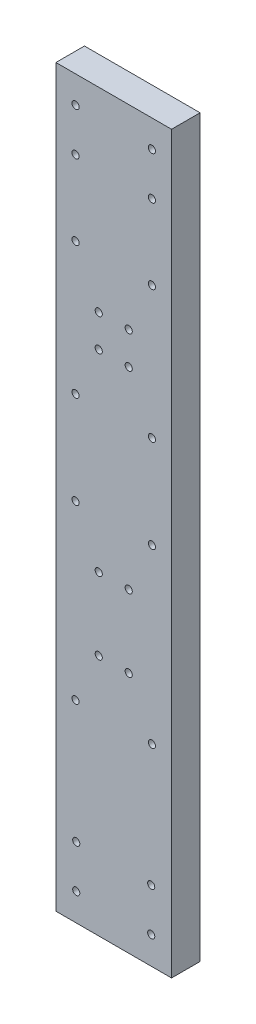
ISO-10303-21;
HEADER;
FILE_DESCRIPTION(('STEP AP214'),'2;1');
FILE_NAME('part.step','',(''),(''),'','','');
FILE_SCHEMA(('AUTOMOTIVE_DESIGN { 1 0 10303 214 1 1 1 1 }'));
ENDSEC;
DATA;
#1=APPLICATION_CONTEXT('core data for automotive mechanical design processes');
#2=APPLICATION_PROTOCOL_DEFINITION('international standard','automotive_design',2000,#1);
#3=PRODUCT_CONTEXT('',#1,'mechanical');
#4=PRODUCT('Part','Part','',(#3));
#5=PRODUCT_RELATED_PRODUCT_CATEGORY('part','',(#4));
#6=PRODUCT_DEFINITION_FORMATION('','',#4);
#7=PRODUCT_DEFINITION_CONTEXT('part definition',#1,'design');
#8=PRODUCT_DEFINITION('design','',#6,#7);
#9=PRODUCT_DEFINITION_SHAPE('','',#8);
#10=(LENGTH_UNIT() NAMED_UNIT(*) SI_UNIT(.MILLI.,.METRE.));
#11=(NAMED_UNIT(*) PLANE_ANGLE_UNIT() SI_UNIT($,.RADIAN.));
#12=(NAMED_UNIT(*) SI_UNIT($,.STERADIAN.) SOLID_ANGLE_UNIT());
#13=UNCERTAINTY_MEASURE_WITH_UNIT(LENGTH_MEASURE(1.E-05),#10,'distance_accuracy_value','');
#14=(GEOMETRIC_REPRESENTATION_CONTEXT(3) GLOBAL_UNCERTAINTY_ASSIGNED_CONTEXT((#13)) GLOBAL_UNIT_ASSIGNED_CONTEXT((#10,
#11,#12)) REPRESENTATION_CONTEXT('',''));
#15=CARTESIAN_POINT('',(0.,0.,0.));
#16=DIRECTION('',(0.,0.,1.));
#17=DIRECTION('',(1.,0.,0.));
#18=AXIS2_PLACEMENT_3D('',#15,#16,#17);
#19=CARTESIAN_POINT('',(0.,0.,4.));
#20=DIRECTION('',(0.,0.,-1.));
#21=DIRECTION('',(-1.,0.,0.));
#22=AXIS2_PLACEMENT_3D('',#19,#20,#21);
#23=PLANE('',#22);
#24=CARTESIAN_POINT('',(13.4500000000012,99.1699999999995,4.));
#25=DIRECTION('',(0.,0.,1.));
#26=DIRECTION('',(-1.,0.,0.));
#27=AXIS2_PLACEMENT_3D('',#24,#25,#26);
#28=CIRCLE('',#27,0.499999999999999);
#29=CARTESIAN_POINT('',(12.9500000000012,99.1699999999995,4.));
#30=VERTEX_POINT('',#29);
#31=EDGE_CURVE('E240',#30,#30,#28,.T.);
#32=ORIENTED_EDGE('',*,*,#31,.F.);
#33=EDGE_LOOP('',(#32));
#34=FACE_BOUND('',#33,.T.);
#35=CARTESIAN_POINT('',(13.350000000001,9.84644883105539,4.));
#36=DIRECTION('',(0.,0.,1.));
#37=DIRECTION('',(-1.,0.,0.));
#38=AXIS2_PLACEMENT_3D('',#35,#36,#37);
#39=CIRCLE('',#38,0.499999999999999);
#40=CARTESIAN_POINT('',(12.850000000001,9.84644883105539,4.));
#41=VERTEX_POINT('',#40);
#42=EDGE_CURVE('E228',#41,#41,#39,.T.);
#43=ORIENTED_EDGE('',*,*,#42,.F.);
#44=EDGE_LOOP('',(#43));
#45=FACE_BOUND('',#44,.T.);
#46=CARTESIAN_POINT('',(2.85,9.84644883105539,4.));
#47=DIRECTION('',(0.,0.,1.));
#48=DIRECTION('',(1.,0.,0.));
#49=AXIS2_PLACEMENT_3D('',#46,#47,#48);
#50=CIRCLE('',#49,0.499999999999999);
#51=CARTESIAN_POINT('',(3.35,9.84644883105539,4.));
#52=VERTEX_POINT('',#51);
#53=EDGE_CURVE('E216',#52,#52,#50,.T.);
#54=ORIENTED_EDGE('',*,*,#53,.F.);
#55=EDGE_LOOP('',(#54));
#56=FACE_BOUND('',#55,.T.);
#57=CARTESIAN_POINT('',(13.4500000000022,93.1699999999974,4.));
#58=DIRECTION('',(0.,0.,1.));
#59=DIRECTION('',(1.,0.,0.));
#60=AXIS2_PLACEMENT_3D('',#57,#58,#59);
#61=CIRCLE('',#60,0.499999999999999);
#62=CARTESIAN_POINT('',(13.9500000000022,93.1699999999974,4.));
#63=VERTEX_POINT('',#62);
#64=EDGE_CURVE('E204',#63,#63,#61,.T.);
#65=ORIENTED_EDGE('',*,*,#64,.F.);
#66=EDGE_LOOP('',(#65));
#67=FACE_BOUND('',#66,.T.);
#68=CARTESIAN_POINT('',(13.4500000000001,82.6699999999992,4.));
#69=DIRECTION('',(0.,0.,1.));
#70=DIRECTION('',(1.,0.,0.));
#71=AXIS2_PLACEMENT_3D('',#68,#69,#70);
#72=CIRCLE('',#71,0.499999999999999);
#73=CARTESIAN_POINT('',(13.9500000000001,82.6699999999992,4.));
#74=VERTEX_POINT('',#73);
#75=EDGE_CURVE('E192',#74,#74,#72,.T.);
#76=ORIENTED_EDGE('',*,*,#75,.F.);
#77=EDGE_LOOP('',(#76));
#78=FACE_BOUND('',#77,.T.);
#79=CARTESIAN_POINT('',(13.4500000000001,27.,4.));
#80=DIRECTION('',(0.,0.,1.));
#81=DIRECTION('',(1.,0.,0.));
#82=AXIS2_PLACEMENT_3D('',#79,#80,#81);
#83=CIRCLE('',#82,0.499999999999999);
#84=CARTESIAN_POINT('',(13.9500000000001,27.,4.));
#85=VERTEX_POINT('',#84);
#86=EDGE_CURVE('E180',#85,#85,#83,.T.);
#87=ORIENTED_EDGE('',*,*,#86,.F.);
#88=EDGE_LOOP('',(#87));
#89=FACE_BOUND('',#88,.T.);
#90=CARTESIAN_POINT('',(10.2000000000001,33.9999999999996,4.));
#91=DIRECTION('',(0.,0.,1.));
#92=DIRECTION('',(1.,0.,0.));
#93=AXIS2_PLACEMENT_3D('',#90,#91,#92);
#94=CIRCLE('',#93,0.499999999999999);
#95=CARTESIAN_POINT('',(10.7000000000001,33.9999999999996,4.));
#96=VERTEX_POINT('',#95);
#97=EDGE_CURVE('E168',#96,#96,#94,.T.);
#98=ORIENTED_EDGE('',*,*,#97,.F.);
#99=EDGE_LOOP('',(#98));
#100=FACE_BOUND('',#99,.T.);
#101=CARTESIAN_POINT('',(13.4500000000017,64.139999999999,4.));
#102=DIRECTION('',(0.,0.,1.));
#103=DIRECTION('',(1.,0.,0.));
#104=AXIS2_PLACEMENT_3D('',#101,#102,#103);
#105=CIRCLE('',#104,0.499999999999999);
#106=CARTESIAN_POINT('',(13.9500000000017,64.139999999999,4.));
#107=VERTEX_POINT('',#106);
#108=EDGE_CURVE('E156',#107,#107,#105,.T.);
#109=ORIENTED_EDGE('',*,*,#108,.F.);
#110=EDGE_LOOP('',(#109));
#111=FACE_BOUND('',#110,.T.);
#112=CARTESIAN_POINT('',(13.4500000000001,51.1399999999992,4.));
#113=DIRECTION('',(0.,0.,1.));
#114=DIRECTION('',(1.,0.,0.));
#115=AXIS2_PLACEMENT_3D('',#112,#113,#114);
#116=CIRCLE('',#115,0.499999999999999);
#117=CARTESIAN_POINT('',(13.9500000000001,51.1399999999992,4.));
#118=VERTEX_POINT('',#117);
#119=EDGE_CURVE('E144',#118,#118,#116,.T.);
#120=ORIENTED_EDGE('',*,*,#119,.F.);
#121=EDGE_LOOP('',(#120));
#122=FACE_BOUND('',#121,.T.);
#123=CARTESIAN_POINT('',(6.00000000000134,75.6700000000002,4.));
#124=DIRECTION('',(0.,0.,1.));
#125=DIRECTION('',(-1.,0.,0.));
#126=AXIS2_PLACEMENT_3D('',#123,#124,#125);
#127=CIRCLE('',#126,0.500000000000001);
#128=CARTESIAN_POINT('',(5.50000000000134,75.6700000000002,4.));
#129=VERTEX_POINT('',#128);
#130=EDGE_CURVE('E132',#129,#129,#127,.T.);
#131=ORIENTED_EDGE('',*,*,#130,.F.);
#132=EDGE_LOOP('',(#131));
#133=FACE_BOUND('',#132,.T.);
#134=CARTESIAN_POINT('',(10.2000000000014,71.1399999999987,4.));
#135=DIRECTION('',(0.,0.,1.));
#136=DIRECTION('',(1.,0.,0.));
#137=AXIS2_PLACEMENT_3D('',#134,#135,#136);
#138=CIRCLE('',#137,0.500000000000001);
#139=CARTESIAN_POINT('',(10.7000000000014,71.1399999999987,4.));
#140=VERTEX_POINT('',#139);
#141=EDGE_CURVE('E120',#140,#140,#138,.T.);
#142=ORIENTED_EDGE('',*,*,#141,.F.);
#143=EDGE_LOOP('',(#142));
#144=FACE_BOUND('',#143,.T.);
#145=CARTESIAN_POINT('',(10.2000000000001,44.1399999999995,4.));
#146=DIRECTION('',(0.,0.,1.));
#147=DIRECTION('',(1.,0.,0.));
#148=AXIS2_PLACEMENT_3D('',#145,#146,#147);
#149=CIRCLE('',#148,0.499999999999999);
#150=CARTESIAN_POINT('',(10.7000000000001,44.1399999999995,4.));
#151=VERTEX_POINT('',#150);
#152=EDGE_CURVE('E99',#151,#151,#149,.T.);
#153=ORIENTED_EDGE('',*,*,#152,.F.);
#154=EDGE_LOOP('',(#153));
#155=FACE_BOUND('',#154,.T.);
#156=DIRECTION('',(1.,0.,0.));
#157=VECTOR('',#156,1.);
#158=CARTESIAN_POINT('',(0.,0.,4.));
#159=LINE('',#158,#157);
#160=CARTESIAN_POINT('',(0.,0.,4.));
#161=VERTEX_POINT('',#160);
#162=CARTESIAN_POINT('',(16.2,0.,4.));
#163=VERTEX_POINT('',#162);
#164=EDGE_CURVE('E84',#161,#163,#159,.T.);
#165=ORIENTED_EDGE('',*,*,#164,.T.);
#166=DIRECTION('',(0.,1.,0.));
#167=VECTOR('',#166,1.);
#168=CARTESIAN_POINT('',(16.2,102.97,4.));
#169=LINE('',#168,#167);
#170=CARTESIAN_POINT('',(16.2,102.97,4.));
#171=VERTEX_POINT('',#170);
#172=EDGE_CURVE('E79',#163,#171,#169,.T.);
#173=ORIENTED_EDGE('',*,*,#172,.T.);
#174=DIRECTION('',(-1.,0.,0.));
#175=VECTOR('',#174,1.);
#176=CARTESIAN_POINT('',(0.,102.97,4.));
#177=LINE('',#176,#175);
#178=CARTESIAN_POINT('',(0.,102.97,4.));
#179=VERTEX_POINT('',#178);
#180=EDGE_CURVE('E82',#171,#179,#177,.T.);
#181=ORIENTED_EDGE('',*,*,#180,.T.);
#182=DIRECTION('',(0.,-1.,0.));
#183=VECTOR('',#182,1.);
#184=CARTESIAN_POINT('',(0.,102.97,4.));
#185=LINE('',#184,#183);
#186=EDGE_CURVE('E49',#179,#161,#185,.T.);
#187=ORIENTED_EDGE('',*,*,#186,.T.);
#188=EDGE_LOOP('',(#165,#173,#181,#187));
#189=FACE_BOUND('',#188,.T.);
#190=CARTESIAN_POINT('',(6.00000000000001,44.1399999999995,4.));
#191=DIRECTION('',(0.,0.,1.));
#192=DIRECTION('',(1.,0.,0.));
#193=AXIS2_PLACEMENT_3D('',#190,#191,#192);
#194=CIRCLE('',#193,0.499999999999999);
#195=CARTESIAN_POINT('',(6.5,44.1399999999995,4.));
#196=VERTEX_POINT('',#195);
#197=EDGE_CURVE('E114',#196,#196,#194,.T.);
#198=ORIENTED_EDGE('',*,*,#197,.F.);
#199=EDGE_LOOP('',(#198));
#200=FACE_BOUND('',#199,.T.);
#201=CARTESIAN_POINT('',(6.00000000000134,71.1399999999987,4.));
#202=DIRECTION('',(0.,0.,1.));
#203=DIRECTION('',(1.,0.,0.));
#204=AXIS2_PLACEMENT_3D('',#201,#202,#203);
#205=CIRCLE('',#204,0.500000000000001);
#206=CARTESIAN_POINT('',(6.50000000000134,71.1399999999987,4.));
#207=VERTEX_POINT('',#206);
#208=EDGE_CURVE('E126',#207,#207,#205,.T.);
#209=ORIENTED_EDGE('',*,*,#208,.F.);
#210=EDGE_LOOP('',(#209));
#211=FACE_BOUND('',#210,.T.);
#212=CARTESIAN_POINT('',(10.2000000000014,75.6700000000002,4.));
#213=DIRECTION('',(0.,0.,1.));
#214=DIRECTION('',(-1.,0.,0.));
#215=AXIS2_PLACEMENT_3D('',#212,#213,#214);
#216=CIRCLE('',#215,0.500000000000001);
#217=CARTESIAN_POINT('',(9.70000000000144,75.6700000000002,4.));
#218=VERTEX_POINT('',#217);
#219=EDGE_CURVE('E138',#218,#218,#216,.T.);
#220=ORIENTED_EDGE('',*,*,#219,.F.);
#221=EDGE_LOOP('',(#220));
#222=FACE_BOUND('',#221,.T.);
#223=CARTESIAN_POINT('',(2.75000000000003,51.1399999999994,4.));
#224=DIRECTION('',(0.,0.,1.));
#225=DIRECTION('',(1.,0.,0.));
#226=AXIS2_PLACEMENT_3D('',#223,#224,#225);
#227=CIRCLE('',#226,0.499999999999999);
#228=CARTESIAN_POINT('',(3.25000000000003,51.1399999999994,4.));
#229=VERTEX_POINT('',#228);
#230=EDGE_CURVE('E150',#229,#229,#227,.T.);
#231=ORIENTED_EDGE('',*,*,#230,.F.);
#232=EDGE_LOOP('',(#231));
#233=FACE_BOUND('',#232,.T.);
#234=CARTESIAN_POINT('',(2.75000000000138,64.1399999999992,4.));
#235=DIRECTION('',(0.,0.,1.));
#236=DIRECTION('',(1.,0.,0.));
#237=AXIS2_PLACEMENT_3D('',#234,#235,#236);
#238=CIRCLE('',#237,0.499999999999999);
#239=CARTESIAN_POINT('',(3.25000000000138,64.1399999999992,4.));
#240=VERTEX_POINT('',#239);
#241=EDGE_CURVE('E162',#240,#240,#238,.T.);
#242=ORIENTED_EDGE('',*,*,#241,.F.);
#243=EDGE_LOOP('',(#242));
#244=FACE_BOUND('',#243,.T.);
#245=CARTESIAN_POINT('',(6.00000000000001,33.9999999999996,4.));
#246=DIRECTION('',(0.,0.,1.));
#247=DIRECTION('',(1.,0.,0.));
#248=AXIS2_PLACEMENT_3D('',#245,#246,#247);
#249=CIRCLE('',#248,0.499999999999999);
#250=CARTESIAN_POINT('',(6.5,33.9999999999996,4.));
#251=VERTEX_POINT('',#250);
#252=EDGE_CURVE('E174',#251,#251,#249,.T.);
#253=ORIENTED_EDGE('',*,*,#252,.F.);
#254=EDGE_LOOP('',(#253));
#255=FACE_BOUND('',#254,.T.);
#256=CARTESIAN_POINT('',(2.75000000000004,27.0000000000002,4.));
#257=DIRECTION('',(0.,0.,1.));
#258=DIRECTION('',(1.,0.,0.));
#259=AXIS2_PLACEMENT_3D('',#256,#257,#258);
#260=CIRCLE('',#259,0.499999999999999);
#261=CARTESIAN_POINT('',(3.25000000000004,27.0000000000002,4.));
#262=VERTEX_POINT('',#261);
#263=EDGE_CURVE('E186',#262,#262,#260,.T.);
#264=ORIENTED_EDGE('',*,*,#263,.F.);
#265=EDGE_LOOP('',(#264));
#266=FACE_BOUND('',#265,.T.);
#267=CARTESIAN_POINT('',(2.75000000000004,82.6699999999994,4.));
#268=DIRECTION('',(0.,0.,1.));
#269=DIRECTION('',(1.,0.,0.));
#270=AXIS2_PLACEMENT_3D('',#267,#268,#269);
#271=CIRCLE('',#270,0.499999999999999);
#272=CARTESIAN_POINT('',(3.25000000000004,82.6699999999994,4.));
#273=VERTEX_POINT('',#272);
#274=EDGE_CURVE('E198',#273,#273,#271,.T.);
#275=ORIENTED_EDGE('',*,*,#274,.F.);
#276=EDGE_LOOP('',(#275));
#277=FACE_BOUND('',#276,.T.);
#278=CARTESIAN_POINT('',(2.75000000000093,93.1699999999998,4.));
#279=DIRECTION('',(0.,0.,1.));
#280=DIRECTION('',(1.,0.,0.));
#281=AXIS2_PLACEMENT_3D('',#278,#279,#280);
#282=CIRCLE('',#281,0.499999999999999);
#283=CARTESIAN_POINT('',(3.25000000000093,93.1699999999998,4.));
#284=VERTEX_POINT('',#283);
#285=EDGE_CURVE('E210',#284,#284,#282,.T.);
#286=ORIENTED_EDGE('',*,*,#285,.F.);
#287=EDGE_LOOP('',(#286));
#288=FACE_BOUND('',#287,.T.);
#289=CARTESIAN_POINT('',(2.85,3.84644883105539,4.));
#290=DIRECTION('',(0.,0.,1.));
#291=DIRECTION('',(1.,0.,0.));
#292=AXIS2_PLACEMENT_3D('',#289,#290,#291);
#293=CIRCLE('',#292,0.499999999999999);
#294=CARTESIAN_POINT('',(3.35,3.84644883105539,4.));
#295=VERTEX_POINT('',#294);
#296=EDGE_CURVE('E222',#295,#295,#293,.T.);
#297=ORIENTED_EDGE('',*,*,#296,.F.);
#298=EDGE_LOOP('',(#297));
#299=FACE_BOUND('',#298,.T.);
#300=CARTESIAN_POINT('',(13.350000000001,3.84644883105539,4.));
#301=DIRECTION('',(0.,0.,1.));
#302=DIRECTION('',(-1.,0.,0.));
#303=AXIS2_PLACEMENT_3D('',#300,#301,#302);
#304=CIRCLE('',#303,0.499999999999999);
#305=CARTESIAN_POINT('',(12.850000000001,3.84644883105539,4.));
#306=VERTEX_POINT('',#305);
#307=EDGE_CURVE('E234',#306,#306,#304,.T.);
#308=ORIENTED_EDGE('',*,*,#307,.F.);
#309=EDGE_LOOP('',(#308));
#310=FACE_BOUND('',#309,.T.);
#311=CARTESIAN_POINT('',(2.75000000000093,99.1699999999993,4.));
#312=DIRECTION('',(0.,0.,1.));
#313=DIRECTION('',(-1.,0.,0.));
#314=AXIS2_PLACEMENT_3D('',#311,#312,#313);
#315=CIRCLE('',#314,0.499999999999999);
#316=CARTESIAN_POINT('',(2.25000000000093,99.1699999999993,4.));
#317=VERTEX_POINT('',#316);
#318=EDGE_CURVE('E246',#317,#317,#315,.T.);
#319=ORIENTED_EDGE('',*,*,#318,.F.);
#320=EDGE_LOOP('',(#319));
#321=FACE_BOUND('',#320,.T.);
#322=ADVANCED_FACE('F32',(#34,#45,#56,#67,#78,#89,#100,#111,#122,#133,#144,#155,#189,#200,#211,
#222,#233,#244,#255,#266,#277,#288,#299,#310,#321),#23,.F.);
#323=CARTESIAN_POINT('',(0.,0.,0.));
#324=DIRECTION('',(0.,0.,-1.));
#325=DIRECTION('',(-1.,0.,0.));
#326=AXIS2_PLACEMENT_3D('',#323,#324,#325);
#327=PLANE('',#326);
#328=CARTESIAN_POINT('',(13.4500000000012,99.1699999999995,0.));
#329=DIRECTION('',(0.,0.,1.));
#330=DIRECTION('',(-1.,0.,0.));
#331=AXIS2_PLACEMENT_3D('',#328,#329,#330);
#332=CIRCLE('',#331,0.499999999999999);
#333=CARTESIAN_POINT('',(12.9500000000012,99.1699999999995,0.));
#334=VERTEX_POINT('',#333);
#335=EDGE_CURVE('E243',#334,#334,#332,.T.);
#336=ORIENTED_EDGE('',*,*,#335,.T.);
#337=EDGE_LOOP('',(#336));
#338=FACE_BOUND('',#337,.T.);
#339=CARTESIAN_POINT('',(13.350000000001,9.84644883105539,0.));
#340=DIRECTION('',(0.,0.,1.));
#341=DIRECTION('',(-1.,0.,0.));
#342=AXIS2_PLACEMENT_3D('',#339,#340,#341);
#343=CIRCLE('',#342,0.499999999999999);
#344=CARTESIAN_POINT('',(12.850000000001,9.84644883105539,0.));
#345=VERTEX_POINT('',#344);
#346=EDGE_CURVE('E231',#345,#345,#343,.T.);
#347=ORIENTED_EDGE('',*,*,#346,.T.);
#348=EDGE_LOOP('',(#347));
#349=FACE_BOUND('',#348,.T.);
#350=CARTESIAN_POINT('',(2.85,9.84644883105539,0.));
#351=DIRECTION('',(0.,0.,1.));
#352=DIRECTION('',(1.,0.,0.));
#353=AXIS2_PLACEMENT_3D('',#350,#351,#352);
#354=CIRCLE('',#353,0.499999999999999);
#355=CARTESIAN_POINT('',(3.35,9.84644883105539,0.));
#356=VERTEX_POINT('',#355);
#357=EDGE_CURVE('E219',#356,#356,#354,.T.);
#358=ORIENTED_EDGE('',*,*,#357,.T.);
#359=EDGE_LOOP('',(#358));
#360=FACE_BOUND('',#359,.T.);
#361=CARTESIAN_POINT('',(13.4500000000022,93.1699999999974,0.));
#362=DIRECTION('',(0.,0.,1.));
#363=DIRECTION('',(1.,0.,0.));
#364=AXIS2_PLACEMENT_3D('',#361,#362,#363);
#365=CIRCLE('',#364,0.499999999999999);
#366=CARTESIAN_POINT('',(13.9500000000022,93.1699999999974,0.));
#367=VERTEX_POINT('',#366);
#368=EDGE_CURVE('E207',#367,#367,#365,.T.);
#369=ORIENTED_EDGE('',*,*,#368,.T.);
#370=EDGE_LOOP('',(#369));
#371=FACE_BOUND('',#370,.T.);
#372=CARTESIAN_POINT('',(13.4500000000001,82.6699999999992,0.));
#373=DIRECTION('',(0.,0.,1.));
#374=DIRECTION('',(1.,0.,0.));
#375=AXIS2_PLACEMENT_3D('',#372,#373,#374);
#376=CIRCLE('',#375,0.499999999999999);
#377=CARTESIAN_POINT('',(13.9500000000001,82.6699999999992,0.));
#378=VERTEX_POINT('',#377);
#379=EDGE_CURVE('E195',#378,#378,#376,.T.);
#380=ORIENTED_EDGE('',*,*,#379,.T.);
#381=EDGE_LOOP('',(#380));
#382=FACE_BOUND('',#381,.T.);
#383=CARTESIAN_POINT('',(13.4500000000001,27.,0.));
#384=DIRECTION('',(0.,0.,1.));
#385=DIRECTION('',(1.,0.,0.));
#386=AXIS2_PLACEMENT_3D('',#383,#384,#385);
#387=CIRCLE('',#386,0.499999999999999);
#388=CARTESIAN_POINT('',(13.9500000000001,27.,0.));
#389=VERTEX_POINT('',#388);
#390=EDGE_CURVE('E183',#389,#389,#387,.T.);
#391=ORIENTED_EDGE('',*,*,#390,.T.);
#392=EDGE_LOOP('',(#391));
#393=FACE_BOUND('',#392,.T.);
#394=CARTESIAN_POINT('',(10.2000000000001,33.9999999999996,0.));
#395=DIRECTION('',(0.,0.,1.));
#396=DIRECTION('',(1.,0.,0.));
#397=AXIS2_PLACEMENT_3D('',#394,#395,#396);
#398=CIRCLE('',#397,0.499999999999999);
#399=CARTESIAN_POINT('',(10.7000000000001,33.9999999999996,0.));
#400=VERTEX_POINT('',#399);
#401=EDGE_CURVE('E171',#400,#400,#398,.T.);
#402=ORIENTED_EDGE('',*,*,#401,.T.);
#403=EDGE_LOOP('',(#402));
#404=FACE_BOUND('',#403,.T.);
#405=CARTESIAN_POINT('',(13.4500000000017,64.139999999999,0.));
#406=DIRECTION('',(0.,0.,1.));
#407=DIRECTION('',(1.,0.,0.));
#408=AXIS2_PLACEMENT_3D('',#405,#406,#407);
#409=CIRCLE('',#408,0.499999999999999);
#410=CARTESIAN_POINT('',(13.9500000000017,64.139999999999,0.));
#411=VERTEX_POINT('',#410);
#412=EDGE_CURVE('E159',#411,#411,#409,.T.);
#413=ORIENTED_EDGE('',*,*,#412,.T.);
#414=EDGE_LOOP('',(#413));
#415=FACE_BOUND('',#414,.T.);
#416=CARTESIAN_POINT('',(13.4500000000001,51.1399999999992,0.));
#417=DIRECTION('',(0.,0.,1.));
#418=DIRECTION('',(1.,0.,0.));
#419=AXIS2_PLACEMENT_3D('',#416,#417,#418);
#420=CIRCLE('',#419,0.499999999999999);
#421=CARTESIAN_POINT('',(13.9500000000001,51.1399999999992,0.));
#422=VERTEX_POINT('',#421);
#423=EDGE_CURVE('E147',#422,#422,#420,.T.);
#424=ORIENTED_EDGE('',*,*,#423,.T.);
#425=EDGE_LOOP('',(#424));
#426=FACE_BOUND('',#425,.T.);
#427=CARTESIAN_POINT('',(6.00000000000134,75.6700000000002,0.));
#428=DIRECTION('',(0.,0.,1.));
#429=DIRECTION('',(-1.,0.,0.));
#430=AXIS2_PLACEMENT_3D('',#427,#428,#429);
#431=CIRCLE('',#430,0.500000000000001);
#432=CARTESIAN_POINT('',(5.50000000000134,75.6700000000002,0.));
#433=VERTEX_POINT('',#432);
#434=EDGE_CURVE('E135',#433,#433,#431,.T.);
#435=ORIENTED_EDGE('',*,*,#434,.T.);
#436=EDGE_LOOP('',(#435));
#437=FACE_BOUND('',#436,.T.);
#438=CARTESIAN_POINT('',(10.2000000000014,71.1399999999987,0.));
#439=DIRECTION('',(0.,0.,1.));
#440=DIRECTION('',(1.,0.,0.));
#441=AXIS2_PLACEMENT_3D('',#438,#439,#440);
#442=CIRCLE('',#441,0.500000000000001);
#443=CARTESIAN_POINT('',(10.7000000000014,71.1399999999987,0.));
#444=VERTEX_POINT('',#443);
#445=EDGE_CURVE('E123',#444,#444,#442,.T.);
#446=ORIENTED_EDGE('',*,*,#445,.T.);
#447=EDGE_LOOP('',(#446));
#448=FACE_BOUND('',#447,.T.);
#449=CARTESIAN_POINT('',(10.2000000000001,44.1399999999995,0.));
#450=DIRECTION('',(0.,0.,1.));
#451=DIRECTION('',(1.,0.,0.));
#452=AXIS2_PLACEMENT_3D('',#449,#450,#451);
#453=CIRCLE('',#452,0.499999999999999);
#454=CARTESIAN_POINT('',(10.7000000000001,44.1399999999995,0.));
#455=VERTEX_POINT('',#454);
#456=EDGE_CURVE('E111',#455,#455,#453,.T.);
#457=ORIENTED_EDGE('',*,*,#456,.T.);
#458=EDGE_LOOP('',(#457));
#459=FACE_BOUND('',#458,.T.);
#460=DIRECTION('',(1.,0.,0.));
#461=VECTOR('',#460,1.);
#462=CARTESIAN_POINT('',(0.,0.,0.));
#463=LINE('',#462,#461);
#464=CARTESIAN_POINT('',(0.,0.,0.));
#465=VERTEX_POINT('',#464);
#466=CARTESIAN_POINT('',(16.2,0.,0.));
#467=VERTEX_POINT('',#466);
#468=EDGE_CURVE('E96',#465,#467,#463,.T.);
#469=ORIENTED_EDGE('',*,*,#468,.F.);
#470=DIRECTION('',(0.,-1.,0.));
#471=VECTOR('',#470,1.);
#472=CARTESIAN_POINT('',(0.,102.97,0.));
#473=LINE('',#472,#471);
#474=CARTESIAN_POINT('',(0.,102.97,0.));
#475=VERTEX_POINT('',#474);
#476=EDGE_CURVE('E72',#475,#465,#473,.T.);
#477=ORIENTED_EDGE('',*,*,#476,.F.);
#478=DIRECTION('',(-1.,0.,0.));
#479=VECTOR('',#478,1.);
#480=CARTESIAN_POINT('',(0.,102.97,0.));
#481=LINE('',#480,#479);
#482=CARTESIAN_POINT('',(16.2,102.97,0.));
#483=VERTEX_POINT('',#482);
#484=EDGE_CURVE('E66',#483,#475,#481,.T.);
#485=ORIENTED_EDGE('',*,*,#484,.F.);
#486=DIRECTION('',(0.,1.,0.));
#487=VECTOR('',#486,1.);
#488=CARTESIAN_POINT('',(16.2,102.97,0.));
#489=LINE('',#488,#487);
#490=EDGE_CURVE('E88',#467,#483,#489,.T.);
#491=ORIENTED_EDGE('',*,*,#490,.F.);
#492=EDGE_LOOP('',(#469,#477,#485,#491));
#493=FACE_BOUND('',#492,.T.);
#494=CARTESIAN_POINT('',(6.00000000000001,44.1399999999995,0.));
#495=DIRECTION('',(0.,0.,1.));
#496=DIRECTION('',(1.,0.,0.));
#497=AXIS2_PLACEMENT_3D('',#494,#495,#496);
#498=CIRCLE('',#497,0.499999999999999);
#499=CARTESIAN_POINT('',(6.5,44.1399999999995,0.));
#500=VERTEX_POINT('',#499);
#501=EDGE_CURVE('E117',#500,#500,#498,.T.);
#502=ORIENTED_EDGE('',*,*,#501,.T.);
#503=EDGE_LOOP('',(#502));
#504=FACE_BOUND('',#503,.T.);
#505=CARTESIAN_POINT('',(6.00000000000134,71.1399999999987,0.));
#506=DIRECTION('',(0.,0.,1.));
#507=DIRECTION('',(1.,0.,0.));
#508=AXIS2_PLACEMENT_3D('',#505,#506,#507);
#509=CIRCLE('',#508,0.500000000000001);
#510=CARTESIAN_POINT('',(6.50000000000134,71.1399999999987,0.));
#511=VERTEX_POINT('',#510);
#512=EDGE_CURVE('E129',#511,#511,#509,.T.);
#513=ORIENTED_EDGE('',*,*,#512,.T.);
#514=EDGE_LOOP('',(#513));
#515=FACE_BOUND('',#514,.T.);
#516=CARTESIAN_POINT('',(10.2000000000014,75.6700000000002,0.));
#517=DIRECTION('',(0.,0.,1.));
#518=DIRECTION('',(-1.,0.,0.));
#519=AXIS2_PLACEMENT_3D('',#516,#517,#518);
#520=CIRCLE('',#519,0.500000000000001);
#521=CARTESIAN_POINT('',(9.70000000000144,75.6700000000002,0.));
#522=VERTEX_POINT('',#521);
#523=EDGE_CURVE('E141',#522,#522,#520,.T.);
#524=ORIENTED_EDGE('',*,*,#523,.T.);
#525=EDGE_LOOP('',(#524));
#526=FACE_BOUND('',#525,.T.);
#527=CARTESIAN_POINT('',(2.75000000000003,51.1399999999994,0.));
#528=DIRECTION('',(0.,0.,1.));
#529=DIRECTION('',(1.,0.,0.));
#530=AXIS2_PLACEMENT_3D('',#527,#528,#529);
#531=CIRCLE('',#530,0.499999999999999);
#532=CARTESIAN_POINT('',(3.25000000000003,51.1399999999994,0.));
#533=VERTEX_POINT('',#532);
#534=EDGE_CURVE('E153',#533,#533,#531,.T.);
#535=ORIENTED_EDGE('',*,*,#534,.T.);
#536=EDGE_LOOP('',(#535));
#537=FACE_BOUND('',#536,.T.);
#538=CARTESIAN_POINT('',(2.75000000000138,64.1399999999992,0.));
#539=DIRECTION('',(0.,0.,1.));
#540=DIRECTION('',(1.,0.,0.));
#541=AXIS2_PLACEMENT_3D('',#538,#539,#540);
#542=CIRCLE('',#541,0.499999999999999);
#543=CARTESIAN_POINT('',(3.25000000000138,64.1399999999992,0.));
#544=VERTEX_POINT('',#543);
#545=EDGE_CURVE('E165',#544,#544,#542,.T.);
#546=ORIENTED_EDGE('',*,*,#545,.T.);
#547=EDGE_LOOP('',(#546));
#548=FACE_BOUND('',#547,.T.);
#549=CARTESIAN_POINT('',(6.00000000000001,33.9999999999996,0.));
#550=DIRECTION('',(0.,0.,1.));
#551=DIRECTION('',(1.,0.,0.));
#552=AXIS2_PLACEMENT_3D('',#549,#550,#551);
#553=CIRCLE('',#552,0.499999999999999);
#554=CARTESIAN_POINT('',(6.5,33.9999999999996,0.));
#555=VERTEX_POINT('',#554);
#556=EDGE_CURVE('E177',#555,#555,#553,.T.);
#557=ORIENTED_EDGE('',*,*,#556,.T.);
#558=EDGE_LOOP('',(#557));
#559=FACE_BOUND('',#558,.T.);
#560=CARTESIAN_POINT('',(2.75000000000004,27.0000000000002,0.));
#561=DIRECTION('',(0.,0.,1.));
#562=DIRECTION('',(1.,0.,0.));
#563=AXIS2_PLACEMENT_3D('',#560,#561,#562);
#564=CIRCLE('',#563,0.499999999999999);
#565=CARTESIAN_POINT('',(3.25000000000004,27.0000000000002,0.));
#566=VERTEX_POINT('',#565);
#567=EDGE_CURVE('E189',#566,#566,#564,.T.);
#568=ORIENTED_EDGE('',*,*,#567,.T.);
#569=EDGE_LOOP('',(#568));
#570=FACE_BOUND('',#569,.T.);
#571=CARTESIAN_POINT('',(2.75000000000004,82.6699999999994,0.));
#572=DIRECTION('',(0.,0.,1.));
#573=DIRECTION('',(1.,0.,0.));
#574=AXIS2_PLACEMENT_3D('',#571,#572,#573);
#575=CIRCLE('',#574,0.499999999999999);
#576=CARTESIAN_POINT('',(3.25000000000004,82.6699999999994,0.));
#577=VERTEX_POINT('',#576);
#578=EDGE_CURVE('E201',#577,#577,#575,.T.);
#579=ORIENTED_EDGE('',*,*,#578,.T.);
#580=EDGE_LOOP('',(#579));
#581=FACE_BOUND('',#580,.T.);
#582=CARTESIAN_POINT('',(2.75000000000093,93.1699999999998,0.));
#583=DIRECTION('',(0.,0.,1.));
#584=DIRECTION('',(1.,0.,0.));
#585=AXIS2_PLACEMENT_3D('',#582,#583,#584);
#586=CIRCLE('',#585,0.499999999999999);
#587=CARTESIAN_POINT('',(3.25000000000093,93.1699999999998,0.));
#588=VERTEX_POINT('',#587);
#589=EDGE_CURVE('E213',#588,#588,#586,.T.);
#590=ORIENTED_EDGE('',*,*,#589,.T.);
#591=EDGE_LOOP('',(#590));
#592=FACE_BOUND('',#591,.T.);
#593=CARTESIAN_POINT('',(2.85,3.84644883105539,0.));
#594=DIRECTION('',(0.,0.,1.));
#595=DIRECTION('',(1.,0.,0.));
#596=AXIS2_PLACEMENT_3D('',#593,#594,#595);
#597=CIRCLE('',#596,0.499999999999999);
#598=CARTESIAN_POINT('',(3.35,3.84644883105539,0.));
#599=VERTEX_POINT('',#598);
#600=EDGE_CURVE('E225',#599,#599,#597,.T.);
#601=ORIENTED_EDGE('',*,*,#600,.T.);
#602=EDGE_LOOP('',(#601));
#603=FACE_BOUND('',#602,.T.);
#604=CARTESIAN_POINT('',(13.350000000001,3.84644883105539,0.));
#605=DIRECTION('',(0.,0.,1.));
#606=DIRECTION('',(-1.,0.,0.));
#607=AXIS2_PLACEMENT_3D('',#604,#605,#606);
#608=CIRCLE('',#607,0.499999999999999);
#609=CARTESIAN_POINT('',(12.850000000001,3.84644883105539,0.));
#610=VERTEX_POINT('',#609);
#611=EDGE_CURVE('E237',#610,#610,#608,.T.);
#612=ORIENTED_EDGE('',*,*,#611,.T.);
#613=EDGE_LOOP('',(#612));
#614=FACE_BOUND('',#613,.T.);
#615=CARTESIAN_POINT('',(2.75000000000093,99.1699999999993,0.));
#616=DIRECTION('',(0.,0.,1.));
#617=DIRECTION('',(-1.,0.,0.));
#618=AXIS2_PLACEMENT_3D('',#615,#616,#617);
#619=CIRCLE('',#618,0.499999999999999);
#620=CARTESIAN_POINT('',(2.25000000000093,99.1699999999993,0.));
#621=VERTEX_POINT('',#620);
#622=EDGE_CURVE('E249',#621,#621,#619,.T.);
#623=ORIENTED_EDGE('',*,*,#622,.T.);
#624=EDGE_LOOP('',(#623));
#625=FACE_BOUND('',#624,.T.);
#626=ADVANCED_FACE('F107',(#338,#349,#360,#371,#382,#393,#404,#415,#426,#437,#448,#459,#493,
#504,#515,#526,#537,#548,#559,#570,#581,#592,#603,#614,#625),#327,.T.);
#627=CARTESIAN_POINT('',(0.,0.,4.));
#628=DIRECTION('',(0.,1.,0.));
#629=DIRECTION('',(0.,0.,1.));
#630=AXIS2_PLACEMENT_3D('',#627,#628,#629);
#631=PLANE('',#630);
#632=ORIENTED_EDGE('',*,*,#468,.T.);
#633=DIRECTION('',(0.,0.,-1.));
#634=VECTOR('',#633,1.);
#635=CARTESIAN_POINT('',(16.2,0.,4.));
#636=LINE('',#635,#634);
#637=EDGE_CURVE('E11',#163,#467,#636,.T.);
#638=ORIENTED_EDGE('',*,*,#637,.F.);
#639=ORIENTED_EDGE('',*,*,#164,.F.);
#640=DIRECTION('',(0.,0.,-1.));
#641=VECTOR('',#640,1.);
#642=CARTESIAN_POINT('',(0.,0.,4.));
#643=LINE('',#642,#641);
#644=EDGE_CURVE('E92',#161,#465,#643,.T.);
#645=ORIENTED_EDGE('',*,*,#644,.T.);
#646=EDGE_LOOP('',(#632,#638,#639,#645));
#647=FACE_BOUND('',#646,.T.);
#648=ADVANCED_FACE('F34',(#647),#631,.F.);
#649=CARTESIAN_POINT('',(16.2,102.97,4.));
#650=DIRECTION('',(-1.,0.,0.));
#651=DIRECTION('',(0.,-1.,0.));
#652=AXIS2_PLACEMENT_3D('',#649,#650,#651);
#653=PLANE('',#652);
#654=ORIENTED_EDGE('',*,*,#490,.T.);
#655=DIRECTION('',(0.,0.,-1.));
#656=VECTOR('',#655,1.);
#657=CARTESIAN_POINT('',(16.2,102.97,4.));
#658=LINE('',#657,#656);
#659=EDGE_CURVE('E41',#171,#483,#658,.T.);
#660=ORIENTED_EDGE('',*,*,#659,.F.);
#661=ORIENTED_EDGE('',*,*,#172,.F.);
#662=ORIENTED_EDGE('',*,*,#637,.T.);
#663=EDGE_LOOP('',(#654,#660,#661,#662));
#664=FACE_BOUND('',#663,.T.);
#665=ADVANCED_FACE('F87',(#664),#653,.F.);
#666=CARTESIAN_POINT('',(0.,102.97,4.));
#667=DIRECTION('',(0.,-1.,0.));
#668=DIRECTION('',(0.,0.,-1.));
#669=AXIS2_PLACEMENT_3D('',#666,#667,#668);
#670=PLANE('',#669);
#671=ORIENTED_EDGE('',*,*,#484,.T.);
#672=DIRECTION('',(0.,0.,-1.));
#673=VECTOR('',#672,1.);
#674=CARTESIAN_POINT('',(0.,102.97,4.));
#675=LINE('',#674,#673);
#676=EDGE_CURVE('E89',#179,#475,#675,.T.);
#677=ORIENTED_EDGE('',*,*,#676,.F.);
#678=ORIENTED_EDGE('',*,*,#180,.F.);
#679=ORIENTED_EDGE('',*,*,#659,.T.);
#680=EDGE_LOOP('',(#671,#677,#678,#679));
#681=FACE_BOUND('',#680,.T.);
#682=ADVANCED_FACE('F90',(#681),#670,.F.);
#683=CARTESIAN_POINT('',(0.,102.97,4.));
#684=DIRECTION('',(1.,0.,0.));
#685=DIRECTION('',(0.,1.,0.));
#686=AXIS2_PLACEMENT_3D('',#683,#684,#685);
#687=PLANE('',#686);
#688=ORIENTED_EDGE('',*,*,#476,.T.);
#689=ORIENTED_EDGE('',*,*,#644,.F.);
#690=ORIENTED_EDGE('',*,*,#186,.F.);
#691=ORIENTED_EDGE('',*,*,#676,.T.);
#692=EDGE_LOOP('',(#688,#689,#690,#691));
#693=FACE_BOUND('',#692,.T.);
#694=ADVANCED_FACE('F104',(#693),#687,.F.);
#695=CARTESIAN_POINT('',(10.2000000000001,44.1399999999995,4.));
#696=DIRECTION('',(0.,0.,-1.));
#697=DIRECTION('',(-1.,0.,0.));
#698=AXIS2_PLACEMENT_3D('',#695,#696,#697);
#699=CYLINDRICAL_SURFACE('',#698,0.499999999999999);
#700=ORIENTED_EDGE('',*,*,#152,.T.);
#701=EDGE_LOOP('',(#700));
#702=FACE_BOUND('',#701,.T.);
#703=ORIENTED_EDGE('',*,*,#456,.F.);
#704=EDGE_LOOP('',(#703));
#705=FACE_BOUND('',#704,.T.);
#706=ADVANCED_FACE('F269',(#702,#705),#699,.F.);
#707=CARTESIAN_POINT('',(6.00000000000001,44.1399999999995,4.));
#708=DIRECTION('',(0.,0.,-1.));
#709=DIRECTION('',(-1.,0.,0.));
#710=AXIS2_PLACEMENT_3D('',#707,#708,#709);
#711=CYLINDRICAL_SURFACE('',#710,0.499999999999999);
#712=ORIENTED_EDGE('',*,*,#197,.T.);
#713=EDGE_LOOP('',(#712));
#714=FACE_BOUND('',#713,.T.);
#715=ORIENTED_EDGE('',*,*,#501,.F.);
#716=EDGE_LOOP('',(#715));
#717=FACE_BOUND('',#716,.T.);
#718=ADVANCED_FACE('F315',(#714,#717),#711,.F.);
#719=CARTESIAN_POINT('',(10.2000000000014,71.1399999999987,4.));
#720=DIRECTION('',(0.,0.,-1.));
#721=DIRECTION('',(-1.,0.,0.));
#722=AXIS2_PLACEMENT_3D('',#719,#720,#721);
#723=CYLINDRICAL_SURFACE('',#722,0.500000000000001);
#724=ORIENTED_EDGE('',*,*,#141,.T.);
#725=EDGE_LOOP('',(#724));
#726=FACE_BOUND('',#725,.T.);
#727=ORIENTED_EDGE('',*,*,#445,.F.);
#728=EDGE_LOOP('',(#727));
#729=FACE_BOUND('',#728,.T.);
#730=ADVANCED_FACE('F323',(#726,#729),#723,.F.);
#731=CARTESIAN_POINT('',(6.00000000000134,71.1399999999987,4.));
#732=DIRECTION('',(0.,0.,-1.));
#733=DIRECTION('',(-1.,0.,0.));
#734=AXIS2_PLACEMENT_3D('',#731,#732,#733);
#735=CYLINDRICAL_SURFACE('',#734,0.500000000000001);
#736=ORIENTED_EDGE('',*,*,#208,.T.);
#737=EDGE_LOOP('',(#736));
#738=FACE_BOUND('',#737,.T.);
#739=ORIENTED_EDGE('',*,*,#512,.F.);
#740=EDGE_LOOP('',(#739));
#741=FACE_BOUND('',#740,.T.);
#742=ADVANCED_FACE('F331',(#738,#741),#735,.F.);
#743=CARTESIAN_POINT('',(6.00000000000134,75.6700000000002,4.));
#744=DIRECTION('',(0.,0.,-1.));
#745=DIRECTION('',(-1.,0.,0.));
#746=AXIS2_PLACEMENT_3D('',#743,#744,#745);
#747=CYLINDRICAL_SURFACE('',#746,0.500000000000001);
#748=ORIENTED_EDGE('',*,*,#130,.T.);
#749=EDGE_LOOP('',(#748));
#750=FACE_BOUND('',#749,.T.);
#751=ORIENTED_EDGE('',*,*,#434,.F.);
#752=EDGE_LOOP('',(#751));
#753=FACE_BOUND('',#752,.T.);
#754=ADVANCED_FACE('F340',(#750,#753),#747,.F.);
#755=CARTESIAN_POINT('',(10.2000000000014,75.6700000000002,4.));
#756=DIRECTION('',(0.,0.,-1.));
#757=DIRECTION('',(-1.,0.,0.));
#758=AXIS2_PLACEMENT_3D('',#755,#756,#757);
#759=CYLINDRICAL_SURFACE('',#758,0.500000000000001);
#760=ORIENTED_EDGE('',*,*,#219,.T.);
#761=EDGE_LOOP('',(#760));
#762=FACE_BOUND('',#761,.T.);
#763=ORIENTED_EDGE('',*,*,#523,.F.);
#764=EDGE_LOOP('',(#763));
#765=FACE_BOUND('',#764,.T.);
#766=ADVANCED_FACE('F349',(#762,#765),#759,.F.);
#767=CARTESIAN_POINT('',(13.4500000000001,51.1399999999992,4.));
#768=DIRECTION('',(0.,0.,-1.));
#769=DIRECTION('',(-1.,0.,0.));
#770=AXIS2_PLACEMENT_3D('',#767,#768,#769);
#771=CYLINDRICAL_SURFACE('',#770,0.499999999999999);
#772=ORIENTED_EDGE('',*,*,#119,.T.);
#773=EDGE_LOOP('',(#772));
#774=FACE_BOUND('',#773,.T.);
#775=ORIENTED_EDGE('',*,*,#423,.F.);
#776=EDGE_LOOP('',(#775));
#777=FACE_BOUND('',#776,.T.);
#778=ADVANCED_FACE('F358',(#774,#777),#771,.F.);
#779=CARTESIAN_POINT('',(2.75000000000003,51.1399999999994,4.));
#780=DIRECTION('',(0.,0.,-1.));
#781=DIRECTION('',(-1.,0.,0.));
#782=AXIS2_PLACEMENT_3D('',#779,#780,#781);
#783=CYLINDRICAL_SURFACE('',#782,0.499999999999999);
#784=ORIENTED_EDGE('',*,*,#230,.T.);
#785=EDGE_LOOP('',(#784));
#786=FACE_BOUND('',#785,.T.);
#787=ORIENTED_EDGE('',*,*,#534,.F.);
#788=EDGE_LOOP('',(#787));
#789=FACE_BOUND('',#788,.T.);
#790=ADVANCED_FACE('F367',(#786,#789),#783,.F.);
#791=CARTESIAN_POINT('',(13.4500000000017,64.139999999999,4.));
#792=DIRECTION('',(0.,0.,-1.));
#793=DIRECTION('',(-1.,0.,0.));
#794=AXIS2_PLACEMENT_3D('',#791,#792,#793);
#795=CYLINDRICAL_SURFACE('',#794,0.499999999999999);
#796=ORIENTED_EDGE('',*,*,#108,.T.);
#797=EDGE_LOOP('',(#796));
#798=FACE_BOUND('',#797,.T.);
#799=ORIENTED_EDGE('',*,*,#412,.F.);
#800=EDGE_LOOP('',(#799));
#801=FACE_BOUND('',#800,.T.);
#802=ADVANCED_FACE('F376',(#798,#801),#795,.F.);
#803=CARTESIAN_POINT('',(2.75000000000138,64.1399999999992,4.));
#804=DIRECTION('',(0.,0.,-1.));
#805=DIRECTION('',(-1.,0.,0.));
#806=AXIS2_PLACEMENT_3D('',#803,#804,#805);
#807=CYLINDRICAL_SURFACE('',#806,0.499999999999999);
#808=ORIENTED_EDGE('',*,*,#241,.T.);
#809=EDGE_LOOP('',(#808));
#810=FACE_BOUND('',#809,.T.);
#811=ORIENTED_EDGE('',*,*,#545,.F.);
#812=EDGE_LOOP('',(#811));
#813=FACE_BOUND('',#812,.T.);
#814=ADVANCED_FACE('F385',(#810,#813),#807,.F.);
#815=CARTESIAN_POINT('',(10.2000000000001,33.9999999999996,4.));
#816=DIRECTION('',(0.,0.,-1.));
#817=DIRECTION('',(-1.,0.,0.));
#818=AXIS2_PLACEMENT_3D('',#815,#816,#817);
#819=CYLINDRICAL_SURFACE('',#818,0.499999999999999);
#820=ORIENTED_EDGE('',*,*,#97,.T.);
#821=EDGE_LOOP('',(#820));
#822=FACE_BOUND('',#821,.T.);
#823=ORIENTED_EDGE('',*,*,#401,.F.);
#824=EDGE_LOOP('',(#823));
#825=FACE_BOUND('',#824,.T.);
#826=ADVANCED_FACE('F394',(#822,#825),#819,.F.);
#827=CARTESIAN_POINT('',(6.00000000000001,33.9999999999996,4.));
#828=DIRECTION('',(0.,0.,-1.));
#829=DIRECTION('',(-1.,0.,0.));
#830=AXIS2_PLACEMENT_3D('',#827,#828,#829);
#831=CYLINDRICAL_SURFACE('',#830,0.499999999999999);
#832=ORIENTED_EDGE('',*,*,#252,.T.);
#833=EDGE_LOOP('',(#832));
#834=FACE_BOUND('',#833,.T.);
#835=ORIENTED_EDGE('',*,*,#556,.F.);
#836=EDGE_LOOP('',(#835));
#837=FACE_BOUND('',#836,.T.);
#838=ADVANCED_FACE('F403',(#834,#837),#831,.F.);
#839=CARTESIAN_POINT('',(13.4500000000001,27.,4.));
#840=DIRECTION('',(0.,0.,-1.));
#841=DIRECTION('',(-1.,0.,0.));
#842=AXIS2_PLACEMENT_3D('',#839,#840,#841);
#843=CYLINDRICAL_SURFACE('',#842,0.499999999999999);
#844=ORIENTED_EDGE('',*,*,#86,.T.);
#845=EDGE_LOOP('',(#844));
#846=FACE_BOUND('',#845,.T.);
#847=ORIENTED_EDGE('',*,*,#390,.F.);
#848=EDGE_LOOP('',(#847));
#849=FACE_BOUND('',#848,.T.);
#850=ADVANCED_FACE('F412',(#846,#849),#843,.F.);
#851=CARTESIAN_POINT('',(2.75000000000004,27.0000000000002,4.));
#852=DIRECTION('',(0.,0.,-1.));
#853=DIRECTION('',(-1.,0.,0.));
#854=AXIS2_PLACEMENT_3D('',#851,#852,#853);
#855=CYLINDRICAL_SURFACE('',#854,0.499999999999999);
#856=ORIENTED_EDGE('',*,*,#263,.T.);
#857=EDGE_LOOP('',(#856));
#858=FACE_BOUND('',#857,.T.);
#859=ORIENTED_EDGE('',*,*,#567,.F.);
#860=EDGE_LOOP('',(#859));
#861=FACE_BOUND('',#860,.T.);
#862=ADVANCED_FACE('F421',(#858,#861),#855,.F.);
#863=CARTESIAN_POINT('',(13.4500000000001,82.6699999999992,4.));
#864=DIRECTION('',(0.,0.,-1.));
#865=DIRECTION('',(-1.,0.,0.));
#866=AXIS2_PLACEMENT_3D('',#863,#864,#865);
#867=CYLINDRICAL_SURFACE('',#866,0.499999999999999);
#868=ORIENTED_EDGE('',*,*,#75,.T.);
#869=EDGE_LOOP('',(#868));
#870=FACE_BOUND('',#869,.T.);
#871=ORIENTED_EDGE('',*,*,#379,.F.);
#872=EDGE_LOOP('',(#871));
#873=FACE_BOUND('',#872,.T.);
#874=ADVANCED_FACE('F430',(#870,#873),#867,.F.);
#875=CARTESIAN_POINT('',(2.75000000000004,82.6699999999994,4.));
#876=DIRECTION('',(0.,0.,-1.));
#877=DIRECTION('',(-1.,0.,0.));
#878=AXIS2_PLACEMENT_3D('',#875,#876,#877);
#879=CYLINDRICAL_SURFACE('',#878,0.499999999999999);
#880=ORIENTED_EDGE('',*,*,#274,.T.);
#881=EDGE_LOOP('',(#880));
#882=FACE_BOUND('',#881,.T.);
#883=ORIENTED_EDGE('',*,*,#578,.F.);
#884=EDGE_LOOP('',(#883));
#885=FACE_BOUND('',#884,.T.);
#886=ADVANCED_FACE('F439',(#882,#885),#879,.F.);
#887=CARTESIAN_POINT('',(13.4500000000022,93.1699999999974,4.));
#888=DIRECTION('',(0.,0.,-1.));
#889=DIRECTION('',(-1.,0.,0.));
#890=AXIS2_PLACEMENT_3D('',#887,#888,#889);
#891=CYLINDRICAL_SURFACE('',#890,0.499999999999999);
#892=ORIENTED_EDGE('',*,*,#64,.T.);
#893=EDGE_LOOP('',(#892));
#894=FACE_BOUND('',#893,.T.);
#895=ORIENTED_EDGE('',*,*,#368,.F.);
#896=EDGE_LOOP('',(#895));
#897=FACE_BOUND('',#896,.T.);
#898=ADVANCED_FACE('F448',(#894,#897),#891,.F.);
#899=CARTESIAN_POINT('',(2.75000000000093,93.1699999999998,4.));
#900=DIRECTION('',(0.,0.,-1.));
#901=DIRECTION('',(-1.,0.,0.));
#902=AXIS2_PLACEMENT_3D('',#899,#900,#901);
#903=CYLINDRICAL_SURFACE('',#902,0.499999999999999);
#904=ORIENTED_EDGE('',*,*,#285,.T.);
#905=EDGE_LOOP('',(#904));
#906=FACE_BOUND('',#905,.T.);
#907=ORIENTED_EDGE('',*,*,#589,.F.);
#908=EDGE_LOOP('',(#907));
#909=FACE_BOUND('',#908,.T.);
#910=ADVANCED_FACE('F457',(#906,#909),#903,.F.);
#911=CARTESIAN_POINT('',(2.85,9.84644883105539,4.));
#912=DIRECTION('',(0.,0.,-1.));
#913=DIRECTION('',(-1.,0.,0.));
#914=AXIS2_PLACEMENT_3D('',#911,#912,#913);
#915=CYLINDRICAL_SURFACE('',#914,0.499999999999999);
#916=ORIENTED_EDGE('',*,*,#53,.T.);
#917=EDGE_LOOP('',(#916));
#918=FACE_BOUND('',#917,.T.);
#919=ORIENTED_EDGE('',*,*,#357,.F.);
#920=EDGE_LOOP('',(#919));
#921=FACE_BOUND('',#920,.T.);
#922=ADVANCED_FACE('F466',(#918,#921),#915,.F.);
#923=CARTESIAN_POINT('',(2.85,3.84644883105539,4.));
#924=DIRECTION('',(0.,0.,-1.));
#925=DIRECTION('',(-1.,0.,0.));
#926=AXIS2_PLACEMENT_3D('',#923,#924,#925);
#927=CYLINDRICAL_SURFACE('',#926,0.499999999999999);
#928=ORIENTED_EDGE('',*,*,#296,.T.);
#929=EDGE_LOOP('',(#928));
#930=FACE_BOUND('',#929,.T.);
#931=ORIENTED_EDGE('',*,*,#600,.F.);
#932=EDGE_LOOP('',(#931));
#933=FACE_BOUND('',#932,.T.);
#934=ADVANCED_FACE('F475',(#930,#933),#927,.F.);
#935=CARTESIAN_POINT('',(13.350000000001,9.84644883105539,4.));
#936=DIRECTION('',(0.,0.,-1.));
#937=DIRECTION('',(-1.,0.,0.));
#938=AXIS2_PLACEMENT_3D('',#935,#936,#937);
#939=CYLINDRICAL_SURFACE('',#938,0.499999999999999);
#940=ORIENTED_EDGE('',*,*,#42,.T.);
#941=EDGE_LOOP('',(#940));
#942=FACE_BOUND('',#941,.T.);
#943=ORIENTED_EDGE('',*,*,#346,.F.);
#944=EDGE_LOOP('',(#943));
#945=FACE_BOUND('',#944,.T.);
#946=ADVANCED_FACE('F484',(#942,#945),#939,.F.);
#947=CARTESIAN_POINT('',(13.350000000001,3.84644883105539,4.));
#948=DIRECTION('',(0.,0.,-1.));
#949=DIRECTION('',(-1.,0.,0.));
#950=AXIS2_PLACEMENT_3D('',#947,#948,#949);
#951=CYLINDRICAL_SURFACE('',#950,0.499999999999999);
#952=ORIENTED_EDGE('',*,*,#307,.T.);
#953=EDGE_LOOP('',(#952));
#954=FACE_BOUND('',#953,.T.);
#955=ORIENTED_EDGE('',*,*,#611,.F.);
#956=EDGE_LOOP('',(#955));
#957=FACE_BOUND('',#956,.T.);
#958=ADVANCED_FACE('F493',(#954,#957),#951,.F.);
#959=CARTESIAN_POINT('',(13.4500000000012,99.1699999999995,4.));
#960=DIRECTION('',(0.,0.,-1.));
#961=DIRECTION('',(-1.,0.,0.));
#962=AXIS2_PLACEMENT_3D('',#959,#960,#961);
#963=CYLINDRICAL_SURFACE('',#962,0.499999999999999);
#964=ORIENTED_EDGE('',*,*,#31,.T.);
#965=EDGE_LOOP('',(#964));
#966=FACE_BOUND('',#965,.T.);
#967=ORIENTED_EDGE('',*,*,#335,.F.);
#968=EDGE_LOOP('',(#967));
#969=FACE_BOUND('',#968,.T.);
#970=ADVANCED_FACE('F502',(#966,#969),#963,.F.);
#971=CARTESIAN_POINT('',(2.75000000000093,99.1699999999993,4.));
#972=DIRECTION('',(0.,0.,-1.));
#973=DIRECTION('',(-1.,0.,0.));
#974=AXIS2_PLACEMENT_3D('',#971,#972,#973);
#975=CYLINDRICAL_SURFACE('',#974,0.499999999999999);
#976=ORIENTED_EDGE('',*,*,#318,.T.);
#977=EDGE_LOOP('',(#976));
#978=FACE_BOUND('',#977,.T.);
#979=ORIENTED_EDGE('',*,*,#622,.F.);
#980=EDGE_LOOP('',(#979));
#981=FACE_BOUND('',#980,.T.);
#982=ADVANCED_FACE('F255',(#978,#981),#975,.F.);
#983=CLOSED_SHELL('',(#322,#626,#648,#665,#682,#694,#706,#718,#730,#742,#754,#766,#778,#790,
#802,#814,#826,#838,#850,#862,#874,#886,#898,#910,#922,#934,#946,#958,#970,#982));
#984=MANIFOLD_SOLID_BREP('B2',#983);
#985=ADVANCED_BREP_SHAPE_REPRESENTATION('',(#18,#984),#14);
#986=SHAPE_DEFINITION_REPRESENTATION(#9,#985);
ENDSEC;
END-ISO-10303-21;
